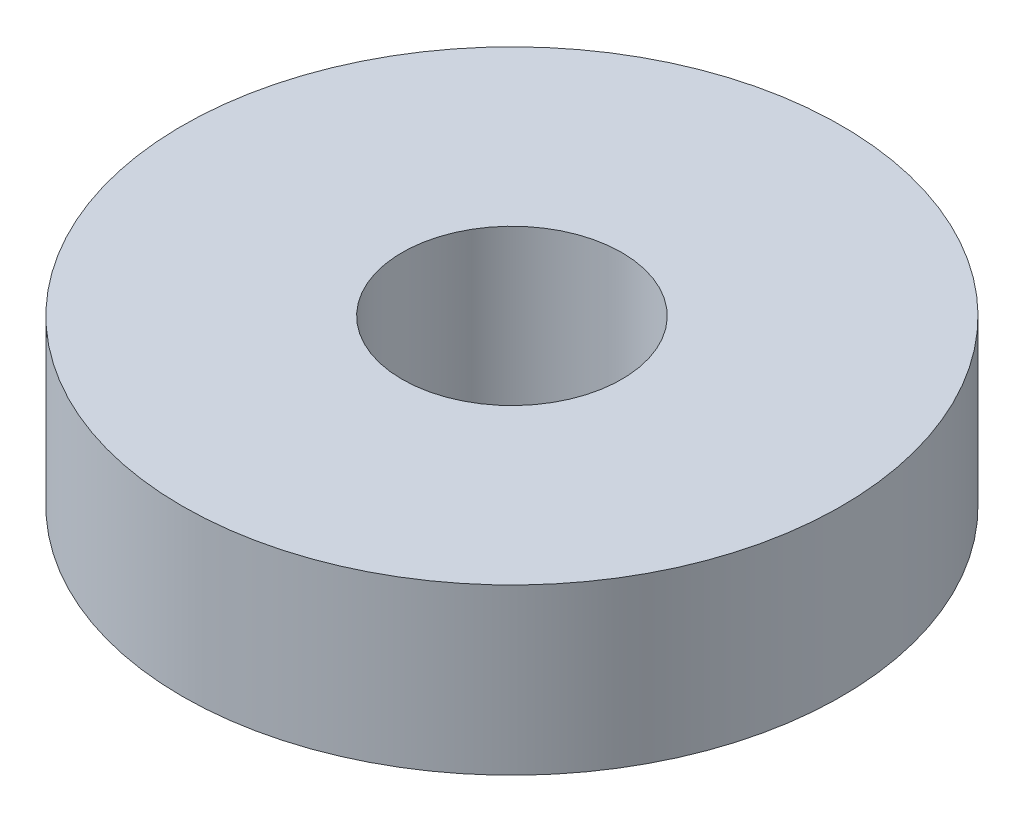
ISO-10303-21;
HEADER;
FILE_DESCRIPTION(('STEP AP214'),'2;1');
FILE_NAME('part.step','',(''),(''),'','','');
FILE_SCHEMA(('AUTOMOTIVE_DESIGN { 1 0 10303 214 1 1 1 1 }'));
ENDSEC;
DATA;
#1=APPLICATION_CONTEXT('core data for automotive mechanical design processes');
#2=APPLICATION_PROTOCOL_DEFINITION('international standard','automotive_design',2000,#1);
#3=PRODUCT_CONTEXT('',#1,'mechanical');
#4=PRODUCT('Part','Part','',(#3));
#5=PRODUCT_RELATED_PRODUCT_CATEGORY('part','',(#4));
#6=PRODUCT_DEFINITION_FORMATION('','',#4);
#7=PRODUCT_DEFINITION_CONTEXT('part definition',#1,'design');
#8=PRODUCT_DEFINITION('design','',#6,#7);
#9=PRODUCT_DEFINITION_SHAPE('','',#8);
#10=(LENGTH_UNIT() NAMED_UNIT(*) SI_UNIT(.MILLI.,.METRE.));
#11=(NAMED_UNIT(*) PLANE_ANGLE_UNIT() SI_UNIT($,.RADIAN.));
#12=(NAMED_UNIT(*) SI_UNIT($,.STERADIAN.) SOLID_ANGLE_UNIT());
#13=UNCERTAINTY_MEASURE_WITH_UNIT(LENGTH_MEASURE(1.E-05),#10,'distance_accuracy_value','');
#14=(GEOMETRIC_REPRESENTATION_CONTEXT(3) GLOBAL_UNCERTAINTY_ASSIGNED_CONTEXT((#13)) GLOBAL_UNIT_ASSIGNED_CONTEXT((#10,
#11,#12)) REPRESENTATION_CONTEXT('',''));
#15=CARTESIAN_POINT('',(0.,0.,0.));
#16=DIRECTION('',(0.,0.,1.));
#17=DIRECTION('',(1.,0.,0.));
#18=AXIS2_PLACEMENT_3D('',#15,#16,#17);
#19=CARTESIAN_POINT('',(0.,6.,0.));
#20=DIRECTION('',(0.,1.,0.));
#21=DIRECTION('',(0.,0.,1.));
#22=AXIS2_PLACEMENT_3D('',#19,#20,#21);
#23=PLANE('',#22);
#24=CARTESIAN_POINT('',(0.,6.,0.));
#25=DIRECTION('',(0.,1.,0.));
#26=DIRECTION('',(0.,0.,1.));
#27=AXIS2_PLACEMENT_3D('',#24,#25,#26);
#28=CIRCLE('',#27,12.);
#29=CARTESIAN_POINT('',(0.,6.,12.));
#30=VERTEX_POINT('',#29);
#31=EDGE_CURVE('E10',#30,#30,#28,.T.);
#32=ORIENTED_EDGE('',*,*,#31,.T.);
#33=EDGE_LOOP('',(#32));
#34=FACE_BOUND('',#33,.T.);
#35=CARTESIAN_POINT('',(0.,6.,0.));
#36=DIRECTION('',(0.,1.,0.));
#37=DIRECTION('',(0.,0.,1.));
#38=AXIS2_PLACEMENT_3D('',#35,#36,#37);
#39=CIRCLE('',#38,4.);
#40=CARTESIAN_POINT('',(0.,6.,4.));
#41=VERTEX_POINT('',#40);
#42=EDGE_CURVE('E44',#41,#41,#39,.T.);
#43=ORIENTED_EDGE('',*,*,#42,.F.);
#44=EDGE_LOOP('',(#43));
#45=FACE_BOUND('',#44,.T.);
#46=ADVANCED_FACE('F33',(#34,#45),#23,.T.);
#47=CARTESIAN_POINT('',(0.,0.,0.));
#48=DIRECTION('',(0.,1.,0.));
#49=DIRECTION('',(0.,0.,1.));
#50=AXIS2_PLACEMENT_3D('',#47,#48,#49);
#51=PLANE('',#50);
#52=CARTESIAN_POINT('',(0.,0.,0.));
#53=DIRECTION('',(0.,1.,0.));
#54=DIRECTION('',(0.,0.,1.));
#55=AXIS2_PLACEMENT_3D('',#52,#53,#54);
#56=CIRCLE('',#55,12.);
#57=CARTESIAN_POINT('',(0.,0.,12.));
#58=VERTEX_POINT('',#57);
#59=EDGE_CURVE('E37',#58,#58,#56,.T.);
#60=ORIENTED_EDGE('',*,*,#59,.F.);
#61=EDGE_LOOP('',(#60));
#62=FACE_BOUND('',#61,.T.);
#63=CARTESIAN_POINT('',(0.,0.,0.));
#64=DIRECTION('',(0.,1.,0.));
#65=DIRECTION('',(0.,0.,1.));
#66=AXIS2_PLACEMENT_3D('',#63,#64,#65);
#67=CIRCLE('',#66,4.);
#68=CARTESIAN_POINT('',(0.,0.,4.));
#69=VERTEX_POINT('',#68);
#70=EDGE_CURVE('E46',#69,#69,#67,.T.);
#71=ORIENTED_EDGE('',*,*,#70,.T.);
#72=EDGE_LOOP('',(#71));
#73=FACE_BOUND('',#72,.T.);
#74=ADVANCED_FACE('F56',(#62,#73),#51,.F.);
#75=CARTESIAN_POINT('',(0.,6.,0.));
#76=DIRECTION('',(0.,-1.,0.));
#77=DIRECTION('',(0.,0.,-1.));
#78=AXIS2_PLACEMENT_3D('',#75,#76,#77);
#79=CYLINDRICAL_SURFACE('',#78,12.);
#80=ORIENTED_EDGE('',*,*,#31,.F.);
#81=EDGE_LOOP('',(#80));
#82=FACE_BOUND('',#81,.T.);
#83=ORIENTED_EDGE('',*,*,#59,.T.);
#84=EDGE_LOOP('',(#83));
#85=FACE_BOUND('',#84,.T.);
#86=ADVANCED_FACE('F35',(#82,#85),#79,.T.);
#87=CARTESIAN_POINT('',(0.,6.,0.));
#88=DIRECTION('',(0.,-1.,0.));
#89=DIRECTION('',(0.,0.,-1.));
#90=AXIS2_PLACEMENT_3D('',#87,#88,#89);
#91=CYLINDRICAL_SURFACE('',#90,4.);
#92=ORIENTED_EDGE('',*,*,#42,.T.);
#93=EDGE_LOOP('',(#92));
#94=FACE_BOUND('',#93,.T.);
#95=ORIENTED_EDGE('',*,*,#70,.F.);
#96=EDGE_LOOP('',(#95));
#97=FACE_BOUND('',#96,.T.);
#98=ADVANCED_FACE('F52',(#94,#97),#91,.F.);
#99=CLOSED_SHELL('',(#46,#74,#86,#98));
#100=MANIFOLD_SOLID_BREP('B2',#99);
#101=ADVANCED_BREP_SHAPE_REPRESENTATION('',(#18,#100),#14);
#102=SHAPE_DEFINITION_REPRESENTATION(#9,#101);
ENDSEC;
END-ISO-10303-21;
